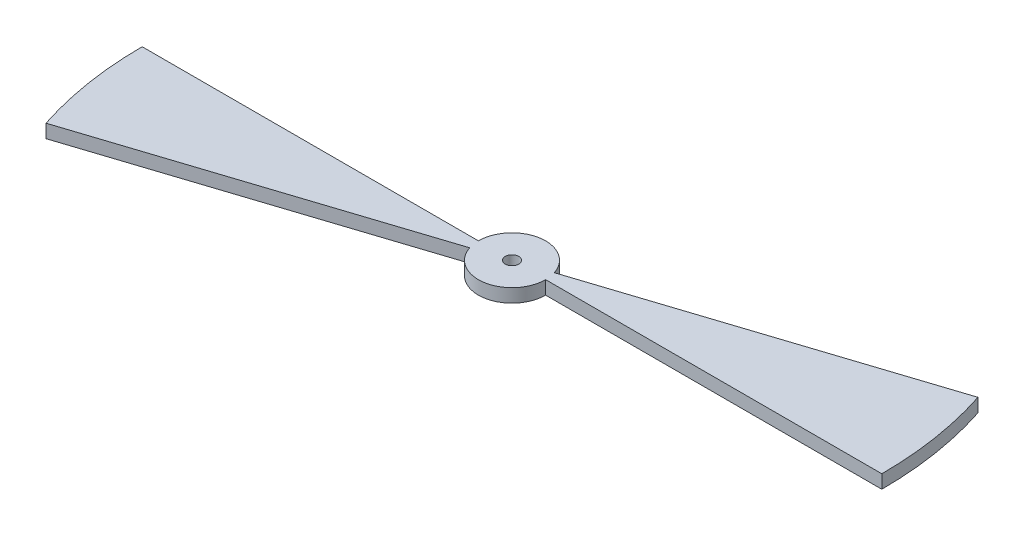
ISO-10303-21;
HEADER;
FILE_DESCRIPTION(('STEP AP214'),'2;1');
FILE_NAME('part.step','',(''),(''),'','','');
FILE_SCHEMA(('AUTOMOTIVE_DESIGN { 1 0 10303 214 1 1 1 1 }'));
ENDSEC;
DATA;
#1=APPLICATION_CONTEXT('core data for automotive mechanical design processes');
#2=APPLICATION_PROTOCOL_DEFINITION('international standard','automotive_design',2000,#1);
#3=PRODUCT_CONTEXT('',#1,'mechanical');
#4=PRODUCT('Part','Part','',(#3));
#5=PRODUCT_RELATED_PRODUCT_CATEGORY('part','',(#4));
#6=PRODUCT_DEFINITION_FORMATION('','',#4);
#7=PRODUCT_DEFINITION_CONTEXT('part definition',#1,'design');
#8=PRODUCT_DEFINITION('design','',#6,#7);
#9=PRODUCT_DEFINITION_SHAPE('','',#8);
#10=(LENGTH_UNIT() NAMED_UNIT(*) SI_UNIT(.MILLI.,.METRE.));
#11=(NAMED_UNIT(*) PLANE_ANGLE_UNIT() SI_UNIT($,.RADIAN.));
#12=(NAMED_UNIT(*) SI_UNIT($,.STERADIAN.) SOLID_ANGLE_UNIT());
#13=UNCERTAINTY_MEASURE_WITH_UNIT(LENGTH_MEASURE(1.E-05),#10,'distance_accuracy_value','');
#14=(GEOMETRIC_REPRESENTATION_CONTEXT(3) GLOBAL_UNCERTAINTY_ASSIGNED_CONTEXT((#13)) GLOBAL_UNIT_ASSIGNED_CONTEXT((#10,
#11,#12)) REPRESENTATION_CONTEXT('',''));
#15=CARTESIAN_POINT('',(0.,0.,0.));
#16=DIRECTION('',(0.,0.,1.));
#17=DIRECTION('',(1.,0.,0.));
#18=AXIS2_PLACEMENT_3D('',#15,#16,#17);
#19=CARTESIAN_POINT('',(0.,1.,0.));
#20=DIRECTION('',(0.,0.,1.));
#21=DIRECTION('',(1.,0.,0.));
#22=AXIS2_PLACEMENT_3D('',#19,#20,#21);
#23=PLANE('',#22);
#24=DIRECTION('',(-1.,0.,0.));
#25=VECTOR('',#24,1.);
#26=CARTESIAN_POINT('',(0.,0.,0.));
#27=LINE('',#26,#25);
#28=CARTESIAN_POINT('',(-2.5,0.,0.));
#29=VERTEX_POINT('',#28);
#30=CARTESIAN_POINT('',(-27.5,0.,0.));
#31=VERTEX_POINT('',#30);
#32=EDGE_CURVE('E135',#29,#31,#27,.T.);
#33=ORIENTED_EDGE('',*,*,#32,.T.);
#34=DIRECTION('',(0.,-1.,0.));
#35=VECTOR('',#34,1.);
#36=CARTESIAN_POINT('',(-27.5,1.,0.));
#37=LINE('',#36,#35);
#38=CARTESIAN_POINT('',(-27.5,1.,0.));
#39=VERTEX_POINT('',#38);
#40=EDGE_CURVE('E11',#39,#31,#37,.T.);
#41=ORIENTED_EDGE('',*,*,#40,.F.);
#42=DIRECTION('',(-1.,0.,0.));
#43=VECTOR('',#42,1.);
#44=CARTESIAN_POINT('',(0.,1.,0.));
#45=LINE('',#44,#43);
#46=CARTESIAN_POINT('',(-2.5,1.,0.));
#47=VERTEX_POINT('',#46);
#48=EDGE_CURVE('E154',#47,#39,#45,.T.);
#49=ORIENTED_EDGE('',*,*,#48,.F.);
#50=DIRECTION('',(0.,-1.,0.));
#51=VECTOR('',#50,1.);
#52=CARTESIAN_POINT('',(-2.5,1.,0.));
#53=LINE('',#52,#51);
#54=EDGE_CURVE('E134',#47,#29,#53,.T.);
#55=ORIENTED_EDGE('',*,*,#54,.T.);
#56=EDGE_LOOP('',(#33,#41,#49,#55));
#57=FACE_BOUND('',#56,.T.);
#58=ADVANCED_FACE('F35',(#57),#23,.F.);
#59=CARTESIAN_POINT('',(0.,1.,0.));
#60=DIRECTION('',(0.,-1.,0.));
#61=DIRECTION('',(0.,0.,-1.));
#62=AXIS2_PLACEMENT_3D('',#59,#60,#61);
#63=CYLINDRICAL_SURFACE('',#62,27.5);
#64=CARTESIAN_POINT('',(0.,0.,0.));
#65=DIRECTION('',(0.,1.,0.));
#66=DIRECTION('',(0.,0.,1.));
#67=AXIS2_PLACEMENT_3D('',#64,#65,#66);
#68=CIRCLE('',#67,27.5);
#69=CARTESIAN_POINT('',(-26.1540541981167,0.,8.49796734531106));
#70=VERTEX_POINT('',#69);
#71=EDGE_CURVE('E138',#31,#70,#68,.T.);
#72=ORIENTED_EDGE('',*,*,#71,.T.);
#73=DIRECTION('',(0.,-1.,0.));
#74=VECTOR('',#73,1.);
#75=CARTESIAN_POINT('',(-26.1540541981167,1.,8.49796734531106));
#76=LINE('',#75,#74);
#77=CARTESIAN_POINT('',(-26.1540541981167,1.,8.49796734531106));
#78=VERTEX_POINT('',#77);
#79=EDGE_CURVE('E43',#78,#70,#76,.T.);
#80=ORIENTED_EDGE('',*,*,#79,.F.);
#81=CARTESIAN_POINT('',(0.,1.,0.));
#82=DIRECTION('',(0.,1.,0.));
#83=DIRECTION('',(0.,0.,1.));
#84=AXIS2_PLACEMENT_3D('',#81,#82,#83);
#85=CIRCLE('',#84,27.5);
#86=EDGE_CURVE('E90',#39,#78,#85,.T.);
#87=ORIENTED_EDGE('',*,*,#86,.F.);
#88=ORIENTED_EDGE('',*,*,#40,.T.);
#89=EDGE_LOOP('',(#72,#80,#87,#88));
#90=FACE_BOUND('',#89,.T.);
#91=ADVANCED_FACE('F168',(#90),#63,.T.);
#92=CARTESIAN_POINT('',(0.,1.,0.));
#93=DIRECTION('',(0.309016994374948,0.,0.951056516295153));
#94=DIRECTION('',(0.951056516295154,0.,-0.309016994374948));
#95=AXIS2_PLACEMENT_3D('',#92,#93,#94);
#96=PLANE('',#95);
#97=DIRECTION('',(-0.951056516295153,0.,0.309016994374948));
#98=VECTOR('',#97,1.);
#99=CARTESIAN_POINT('',(0.,0.,0.));
#100=LINE('',#99,#98);
#101=CARTESIAN_POINT('',(-2.37764129073789,0.,0.772542485937353));
#102=VERTEX_POINT('',#101);
#103=EDGE_CURVE('E141',#102,#70,#100,.T.);
#104=ORIENTED_EDGE('',*,*,#103,.F.);
#105=DIRECTION('',(0.,-1.,0.));
#106=VECTOR('',#105,1.);
#107=CARTESIAN_POINT('',(-2.37764129073789,1.,0.772542485937353));
#108=LINE('',#107,#106);
#109=CARTESIAN_POINT('',(-2.37764129073789,1.,0.772542485937353));
#110=VERTEX_POINT('',#109);
#111=EDGE_CURVE('E161',#110,#102,#108,.T.);
#112=ORIENTED_EDGE('',*,*,#111,.F.);
#113=DIRECTION('',(-0.951056516295153,0.,0.309016994374948));
#114=VECTOR('',#113,1.);
#115=CARTESIAN_POINT('',(0.,1.,0.));
#116=LINE('',#115,#114);
#117=EDGE_CURVE('E167',#110,#78,#116,.T.);
#118=ORIENTED_EDGE('',*,*,#117,.T.);
#119=ORIENTED_EDGE('',*,*,#79,.T.);
#120=EDGE_LOOP('',(#104,#112,#118,#119));
#121=FACE_BOUND('',#120,.T.);
#122=ADVANCED_FACE('F165',(#121),#96,.T.);
#123=CARTESIAN_POINT('',(0.,1.,0.));
#124=DIRECTION('',(0.,-1.,0.));
#125=DIRECTION('',(0.,0.,-1.));
#126=AXIS2_PLACEMENT_3D('',#123,#124,#125);
#127=CYLINDRICAL_SURFACE('',#126,2.5);
#128=CARTESIAN_POINT('',(0.,0.,0.));
#129=DIRECTION('',(0.,1.,0.));
#130=DIRECTION('',(0.,0.,1.));
#131=AXIS2_PLACEMENT_3D('',#128,#129,#130);
#132=CIRCLE('',#131,2.5);
#133=CARTESIAN_POINT('',(2.5,0.,0.));
#134=VERTEX_POINT('',#133);
#135=EDGE_CURVE('E144',#102,#134,#132,.T.);
#136=ORIENTED_EDGE('',*,*,#135,.T.);
#137=DIRECTION('',(0.,-1.,0.));
#138=VECTOR('',#137,1.);
#139=CARTESIAN_POINT('',(2.5,1.,0.));
#140=LINE('',#139,#138);
#141=CARTESIAN_POINT('',(2.5,1.,0.));
#142=VERTEX_POINT('',#141);
#143=EDGE_CURVE('E158',#142,#134,#140,.T.);
#144=ORIENTED_EDGE('',*,*,#143,.F.);
#145=CARTESIAN_POINT('',(0.,1.,0.));
#146=DIRECTION('',(0.,1.,0.));
#147=DIRECTION('',(0.,0.,1.));
#148=AXIS2_PLACEMENT_3D('',#145,#146,#147);
#149=CIRCLE('',#148,2.5);
#150=EDGE_CURVE('E129',#110,#142,#149,.T.);
#151=ORIENTED_EDGE('',*,*,#150,.F.);
#152=ORIENTED_EDGE('',*,*,#111,.T.);
#153=EDGE_LOOP('',(#136,#144,#151,#152));
#154=FACE_BOUND('',#153,.T.);
#155=ADVANCED_FACE('F178',(#154),#127,.T.);
#156=CARTESIAN_POINT('',(0.,1.,0.));
#157=DIRECTION('',(0.,0.,-1.));
#158=DIRECTION('',(-1.,0.,0.));
#159=AXIS2_PLACEMENT_3D('',#156,#157,#158);
#160=PLANE('',#159);
#161=DIRECTION('',(1.,0.,0.));
#162=VECTOR('',#161,1.);
#163=CARTESIAN_POINT('',(0.,0.,0.));
#164=LINE('',#163,#162);
#165=CARTESIAN_POINT('',(27.5,0.,0.));
#166=VERTEX_POINT('',#165);
#167=EDGE_CURVE('E146',#134,#166,#164,.T.);
#168=ORIENTED_EDGE('',*,*,#167,.T.);
#169=DIRECTION('',(0.,-1.,0.));
#170=VECTOR('',#169,1.);
#171=CARTESIAN_POINT('',(27.5,1.,0.));
#172=LINE('',#171,#170);
#173=CARTESIAN_POINT('',(27.5,1.,0.));
#174=VERTEX_POINT('',#173);
#175=EDGE_CURVE('E123',#174,#166,#172,.T.);
#176=ORIENTED_EDGE('',*,*,#175,.F.);
#177=DIRECTION('',(1.,0.,0.));
#178=VECTOR('',#177,1.);
#179=CARTESIAN_POINT('',(0.,1.,0.));
#180=LINE('',#179,#178);
#181=EDGE_CURVE('E110',#142,#174,#180,.T.);
#182=ORIENTED_EDGE('',*,*,#181,.F.);
#183=ORIENTED_EDGE('',*,*,#143,.T.);
#184=EDGE_LOOP('',(#168,#176,#182,#183));
#185=FACE_BOUND('',#184,.T.);
#186=ADVANCED_FACE('F181',(#185),#160,.F.);
#187=CARTESIAN_POINT('',(0.,1.,0.));
#188=DIRECTION('',(0.,-1.,0.));
#189=DIRECTION('',(0.,0.,-1.));
#190=AXIS2_PLACEMENT_3D('',#187,#188,#189);
#191=CYLINDRICAL_SURFACE('',#190,27.5);
#192=CARTESIAN_POINT('',(0.,0.,0.));
#193=DIRECTION('',(0.,1.,0.));
#194=DIRECTION('',(0.,0.,1.));
#195=AXIS2_PLACEMENT_3D('',#192,#193,#194);
#196=CIRCLE('',#195,27.5);
#197=CARTESIAN_POINT('',(26.1540541981167,0.,-8.49796734531106));
#198=VERTEX_POINT('',#197);
#199=EDGE_CURVE('E119',#166,#198,#196,.T.);
#200=ORIENTED_EDGE('',*,*,#199,.T.);
#201=DIRECTION('',(0.,-1.,0.));
#202=VECTOR('',#201,1.);
#203=CARTESIAN_POINT('',(26.1540541981167,1.,-8.49796734531106));
#204=LINE('',#203,#202);
#205=CARTESIAN_POINT('',(26.1540541981167,1.,-8.49796734531106));
#206=VERTEX_POINT('',#205);
#207=EDGE_CURVE('E116',#206,#198,#204,.T.);
#208=ORIENTED_EDGE('',*,*,#207,.F.);
#209=CARTESIAN_POINT('',(0.,1.,0.));
#210=DIRECTION('',(0.,1.,0.));
#211=DIRECTION('',(0.,0.,1.));
#212=AXIS2_PLACEMENT_3D('',#209,#210,#211);
#213=CIRCLE('',#212,27.5);
#214=EDGE_CURVE('E103',#174,#206,#213,.T.);
#215=ORIENTED_EDGE('',*,*,#214,.F.);
#216=ORIENTED_EDGE('',*,*,#175,.T.);
#217=EDGE_LOOP('',(#200,#208,#215,#216));
#218=FACE_BOUND('',#217,.T.);
#219=ADVANCED_FACE('F117',(#218),#191,.T.);
#220=CARTESIAN_POINT('',(0.,1.,0.));
#221=DIRECTION('',(-0.309016994374949,0.,-0.951056516295153));
#222=DIRECTION('',(-0.951056516295153,0.,0.309016994374949));
#223=AXIS2_PLACEMENT_3D('',#220,#221,#222);
#224=PLANE('',#223);
#225=DIRECTION('',(0.951056516295153,0.,-0.309016994374949));
#226=VECTOR('',#225,1.);
#227=CARTESIAN_POINT('',(0.,0.,0.));
#228=LINE('',#227,#226);
#229=CARTESIAN_POINT('',(2.37764129073789,0.,-0.772542485937338));
#230=VERTEX_POINT('',#229);
#231=EDGE_CURVE('E149',#230,#198,#228,.T.);
#232=ORIENTED_EDGE('',*,*,#231,.F.);
#233=DIRECTION('',(0.,-1.,0.));
#234=VECTOR('',#233,1.);
#235=CARTESIAN_POINT('',(2.37764129073789,1.,-0.772542485937338));
#236=LINE('',#235,#234);
#237=CARTESIAN_POINT('',(2.37764129073789,1.,-0.772542485937338));
#238=VERTEX_POINT('',#237);
#239=EDGE_CURVE('E79',#238,#230,#236,.T.);
#240=ORIENTED_EDGE('',*,*,#239,.F.);
#241=DIRECTION('',(0.951056516295153,0.,-0.309016994374949));
#242=VECTOR('',#241,1.);
#243=CARTESIAN_POINT('',(0.,1.,0.));
#244=LINE('',#243,#242);
#245=EDGE_CURVE('E108',#238,#206,#244,.T.);
#246=ORIENTED_EDGE('',*,*,#245,.T.);
#247=ORIENTED_EDGE('',*,*,#207,.T.);
#248=EDGE_LOOP('',(#232,#240,#246,#247));
#249=FACE_BOUND('',#248,.T.);
#250=ADVANCED_FACE('F125',(#249),#224,.T.);
#251=EDGE_CURVE('E82',#230,#29,#132,.T.);
#252=ORIENTED_EDGE('',*,*,#251,.T.);
#253=ORIENTED_EDGE('',*,*,#54,.F.);
#254=EDGE_CURVE('E51',#238,#47,#149,.T.);
#255=ORIENTED_EDGE('',*,*,#254,.F.);
#256=ORIENTED_EDGE('',*,*,#239,.T.);
#257=EDGE_LOOP('',(#252,#253,#255,#256));
#258=FACE_BOUND('',#257,.T.);
#259=ADVANCED_FACE('F187',(#258),#127,.T.);
#260=CARTESIAN_POINT('',(0.,1.,0.));
#261=DIRECTION('',(0.,-1.,0.));
#262=DIRECTION('',(0.,0.,-1.));
#263=AXIS2_PLACEMENT_3D('',#260,#261,#262);
#264=CYLINDRICAL_SURFACE('',#263,0.5);
#265=CARTESIAN_POINT('',(0.,1.,0.));
#266=DIRECTION('',(0.,1.,0.));
#267=DIRECTION('',(0.,0.,1.));
#268=AXIS2_PLACEMENT_3D('',#265,#266,#267);
#269=CIRCLE('',#268,0.5);
#270=CARTESIAN_POINT('',(0.,1.,0.5));
#271=VERTEX_POINT('',#270);
#272=EDGE_CURVE('E127',#271,#271,#269,.T.);
#273=ORIENTED_EDGE('',*,*,#272,.T.);
#274=EDGE_LOOP('',(#273));
#275=FACE_BOUND('',#274,.T.);
#276=CARTESIAN_POINT('',(0.,0.,0.));
#277=DIRECTION('',(0.,1.,0.));
#278=DIRECTION('',(0.,0.,1.));
#279=AXIS2_PLACEMENT_3D('',#276,#277,#278);
#280=CIRCLE('',#279,0.5);
#281=CARTESIAN_POINT('',(0.,0.,0.5));
#282=VERTEX_POINT('',#281);
#283=EDGE_CURVE('E151',#282,#282,#280,.T.);
#284=ORIENTED_EDGE('',*,*,#283,.F.);
#285=EDGE_LOOP('',(#284));
#286=FACE_BOUND('',#285,.T.);
#287=ADVANCED_FACE('F189',(#275,#286),#264,.F.);
#288=CARTESIAN_POINT('',(0.,1.,0.));
#289=DIRECTION('',(0.,1.,0.));
#290=DIRECTION('',(0.,0.,1.));
#291=AXIS2_PLACEMENT_3D('',#288,#289,#290);
#292=PLANE('',#291);
#293=ORIENTED_EDGE('',*,*,#48,.T.);
#294=ORIENTED_EDGE('',*,*,#86,.T.);
#295=ORIENTED_EDGE('',*,*,#117,.F.);
#296=ORIENTED_EDGE('',*,*,#150,.T.);
#297=ORIENTED_EDGE('',*,*,#181,.T.);
#298=ORIENTED_EDGE('',*,*,#214,.T.);
#299=ORIENTED_EDGE('',*,*,#245,.F.);
#300=ORIENTED_EDGE('',*,*,#254,.T.);
#301=EDGE_LOOP('',(#293,#294,#295,#296,#297,#298,#299,#300));
#302=FACE_BOUND('',#301,.T.);
#303=ORIENTED_EDGE('',*,*,#272,.F.);
#304=EDGE_LOOP('',(#303));
#305=FACE_BOUND('',#304,.T.);
#306=ADVANCED_FACE('F105',(#302,#305),#292,.T.);
#307=CARTESIAN_POINT('',(0.,0.,0.));
#308=DIRECTION('',(0.,1.,0.));
#309=DIRECTION('',(0.,0.,1.));
#310=AXIS2_PLACEMENT_3D('',#307,#308,#309);
#311=PLANE('',#310);
#312=ORIENTED_EDGE('',*,*,#32,.F.);
#313=ORIENTED_EDGE('',*,*,#251,.F.);
#314=ORIENTED_EDGE('',*,*,#231,.T.);
#315=ORIENTED_EDGE('',*,*,#199,.F.);
#316=ORIENTED_EDGE('',*,*,#167,.F.);
#317=ORIENTED_EDGE('',*,*,#135,.F.);
#318=ORIENTED_EDGE('',*,*,#103,.T.);
#319=ORIENTED_EDGE('',*,*,#71,.F.);
#320=EDGE_LOOP('',(#312,#313,#314,#315,#316,#317,#318,#319));
#321=FACE_BOUND('',#320,.T.);
#322=ORIENTED_EDGE('',*,*,#283,.T.);
#323=EDGE_LOOP('',(#322));
#324=FACE_BOUND('',#323,.T.);
#325=ADVANCED_FACE('F173',(#321,#324),#311,.F.);
#326=CLOSED_SHELL('',(#58,#91,#122,#155,#186,#219,#250,#259,#287,#306,#325));
#327=MANIFOLD_SOLID_BREP('B2',#326);
#328=ADVANCED_BREP_SHAPE_REPRESENTATION('',(#18,#327),#14);
#329=SHAPE_DEFINITION_REPRESENTATION(#9,#328);
ENDSEC;
END-ISO-10303-21;
